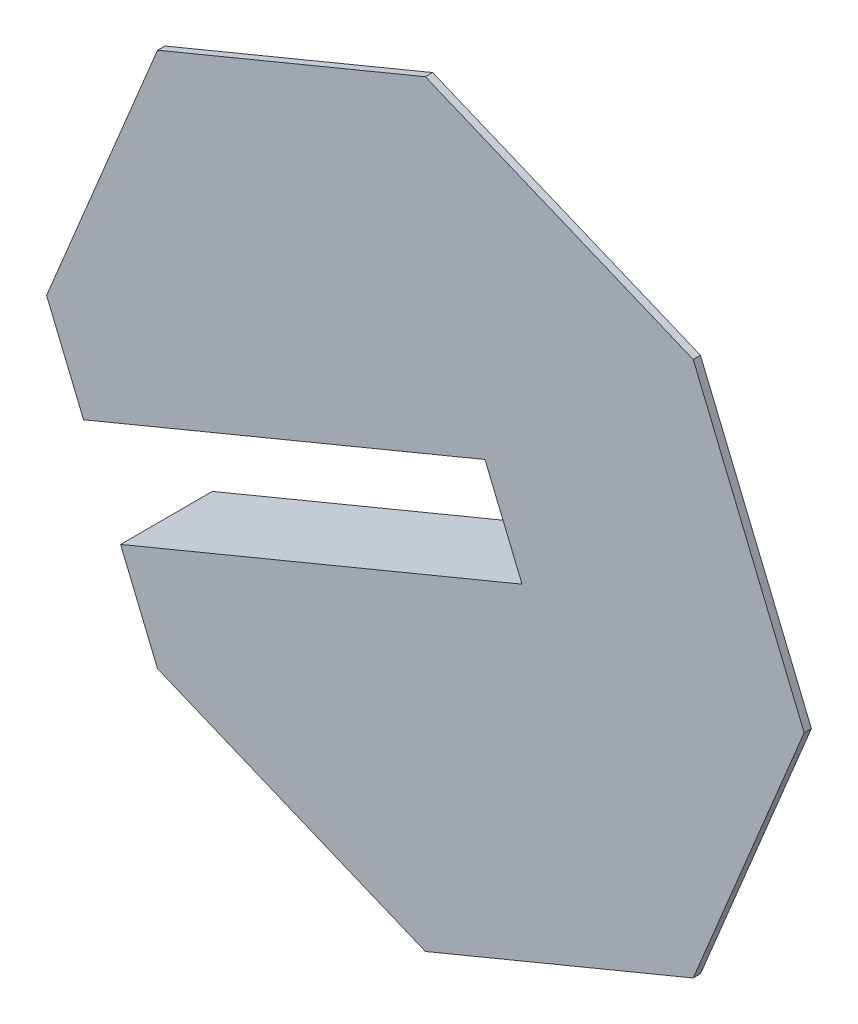
ISO-10303-21;
HEADER;
FILE_DESCRIPTION(('STEP AP214'),'2;1');
FILE_NAME('part.step','',(''),(''),'','','');
FILE_SCHEMA(('AUTOMOTIVE_DESIGN { 1 0 10303 214 1 1 1 1 }'));
ENDSEC;
DATA;
#1=APPLICATION_CONTEXT('core data for automotive mechanical design processes');
#2=APPLICATION_PROTOCOL_DEFINITION('international standard','automotive_design',2000,#1);
#3=PRODUCT_CONTEXT('',#1,'mechanical');
#4=PRODUCT('Part','Part','',(#3));
#5=PRODUCT_RELATED_PRODUCT_CATEGORY('part','',(#4));
#6=PRODUCT_DEFINITION_FORMATION('','',#4);
#7=PRODUCT_DEFINITION_CONTEXT('part definition',#1,'design');
#8=PRODUCT_DEFINITION('design','',#6,#7);
#9=PRODUCT_DEFINITION_SHAPE('','',#8);
#10=(LENGTH_UNIT() NAMED_UNIT(*) SI_UNIT(.MILLI.,.METRE.));
#11=(NAMED_UNIT(*) PLANE_ANGLE_UNIT() SI_UNIT($,.RADIAN.));
#12=(NAMED_UNIT(*) SI_UNIT($,.STERADIAN.) SOLID_ANGLE_UNIT());
#13=UNCERTAINTY_MEASURE_WITH_UNIT(LENGTH_MEASURE(1.E-05),#10,'distance_accuracy_value','');
#14=(GEOMETRIC_REPRESENTATION_CONTEXT(3) GLOBAL_UNCERTAINTY_ASSIGNED_CONTEXT((#13)) GLOBAL_UNIT_ASSIGNED_CONTEXT((#10,
#11,#12)) REPRESENTATION_CONTEXT('',''));
#15=CARTESIAN_POINT('',(0.,0.,0.));
#16=DIRECTION('',(0.,0.,1.));
#17=DIRECTION('',(1.,0.,0.));
#18=AXIS2_PLACEMENT_3D('',#15,#16,#17);
#19=CARTESIAN_POINT('',(0.,0.,0.));
#20=DIRECTION('',(0.,0.,1.));
#21=DIRECTION('',(1.,0.,0.));
#22=AXIS2_PLACEMENT_3D('',#19,#20,#21);
#23=PLANE('',#22);
#24=DIRECTION('',(0.382683432365089,-0.923879532511287,0.));
#25=VECTOR('',#24,1.);
#26=CARTESIAN_POINT('',(40.0028462053296,-5.11600630108544,0.));
#27=LINE('',#26,#25);
#28=CARTESIAN_POINT('',(40.0028462053296,-5.11600630108549,0.));
#29=VERTEX_POINT('',#28);
#30=CARTESIAN_POINT('',(41.1508965024248,-7.88764489861931,0.));
#31=VERTEX_POINT('',#30);
#32=EDGE_CURVE('E274',#29,#31,#27,.T.);
#33=ORIENTED_EDGE('',*,*,#32,.F.);
#34=DIRECTION('',(-0.382683432365089,0.923879532511287,0.));
#35=VECTOR('',#34,1.);
#36=CARTESIAN_POINT('',(40.0028462053296,-5.11600630108549,0.));
#37=LINE('',#36,#35);
#38=CARTESIAN_POINT('',(24.6687210704604,31.9038465666418,0.));
#39=VERTEX_POINT('',#38);
#40=EDGE_CURVE('E180',#29,#39,#37,.T.);
#41=ORIENTED_EDGE('',*,*,#40,.T.);
#42=DIRECTION('',(-0.923879532511287,-0.38268343236509,0.));
#43=VECTOR('',#42,1.);
#44=CARTESIAN_POINT('',(24.6687210704604,31.9038465666418,0.));
#45=LINE('',#44,#43);
#46=CARTESIAN_POINT('',(-141.493612410695,-36.9228455168135,0.));
#47=VERTEX_POINT('',#46);
#48=EDGE_CURVE('E177',#39,#47,#45,.T.);
#49=ORIENTED_EDGE('',*,*,#48,.T.);
#50=DIRECTION('',(0.382683432365089,-0.923879532511287,0.));
#51=VECTOR('',#50,1.);
#52=CARTESIAN_POINT('',(-156.787555785165,0.,0.));
#53=LINE('',#52,#51);
#54=CARTESIAN_POINT('',(-156.787555785165,0.,0.));
#55=VERTEX_POINT('',#54);
#56=EDGE_CURVE('E174',#55,#47,#53,.T.);
#57=ORIENTED_EDGE('',*,*,#56,.F.);
#58=DIRECTION('',(-0.38268343236509,-0.923879532511287,0.));
#59=VECTOR('',#58,1.);
#60=CARTESIAN_POINT('',(-110.865543901354,110.865543901355,0.));
#61=LINE('',#60,#59);
#62=CARTESIAN_POINT('',(-110.865543901354,110.865543901355,0.));
#63=VERTEX_POINT('',#62);
#64=EDGE_CURVE('E172',#63,#55,#61,.T.);
#65=ORIENTED_EDGE('',*,*,#64,.F.);
#66=DIRECTION('',(-0.923879532511287,-0.382683432365089,0.));
#67=VECTOR('',#66,1.);
#68=CARTESIAN_POINT('',(0.,156.787555785165,0.));
#69=LINE('',#68,#67);
#70=CARTESIAN_POINT('',(0.,156.787555785165,0.));
#71=VERTEX_POINT('',#70);
#72=EDGE_CURVE('E169',#71,#63,#69,.T.);
#73=ORIENTED_EDGE('',*,*,#72,.F.);
#74=DIRECTION('',(-0.923879532511287,0.38268343236509,0.));
#75=VECTOR('',#74,1.);
#76=CARTESIAN_POINT('',(110.865543901355,110.865543901355,0.));
#77=LINE('',#76,#75);
#78=CARTESIAN_POINT('',(110.865543901355,110.865543901355,0.));
#79=VERTEX_POINT('',#78);
#80=EDGE_CURVE('E166',#79,#71,#77,.T.);
#81=ORIENTED_EDGE('',*,*,#80,.F.);
#82=DIRECTION('',(-0.382683432365089,0.923879532511287,0.));
#83=VECTOR('',#82,1.);
#84=CARTESIAN_POINT('',(156.787555785165,0.,0.));
#85=LINE('',#84,#83);
#86=CARTESIAN_POINT('',(156.787555785165,0.,0.));
#87=VERTEX_POINT('',#86);
#88=EDGE_CURVE('E103',#87,#79,#85,.T.);
#89=ORIENTED_EDGE('',*,*,#88,.F.);
#90=DIRECTION('',(0.38268343236509,0.923879532511287,0.));
#91=VECTOR('',#90,1.);
#92=CARTESIAN_POINT('',(110.865543901355,-110.865543901354,0.));
#93=LINE('',#92,#91);
#94=CARTESIAN_POINT('',(110.865543901355,-110.865543901354,0.));
#95=VERTEX_POINT('',#94);
#96=EDGE_CURVE('E188',#95,#87,#93,.T.);
#97=ORIENTED_EDGE('',*,*,#96,.F.);
#98=DIRECTION('',(0.923879532511287,0.382683432365089,0.));
#99=VECTOR('',#98,1.);
#100=CARTESIAN_POINT('',(0.,-156.787555785165,0.));
#101=LINE('',#100,#99);
#102=CARTESIAN_POINT('',(0.,-156.787555785165,0.));
#103=VERTEX_POINT('',#102);
#104=EDGE_CURVE('E154',#103,#95,#101,.T.);
#105=ORIENTED_EDGE('',*,*,#104,.F.);
#106=DIRECTION('',(0.923879532511287,-0.38268343236509,0.));
#107=VECTOR('',#106,1.);
#108=CARTESIAN_POINT('',(-110.865543901355,-110.865543901354,0.));
#109=LINE('',#108,#107);
#110=CARTESIAN_POINT('',(-110.865543901355,-110.865543901354,0.));
#111=VERTEX_POINT('',#110);
#112=EDGE_CURVE('E185',#111,#103,#109,.T.);
#113=ORIENTED_EDGE('',*,*,#112,.F.);
#114=DIRECTION('',(0.38268343236509,-0.923879532511287,0.));
#115=VECTOR('',#114,1.);
#116=CARTESIAN_POINT('',(-126.159487275825,-73.9426983845408,0.));
#117=LINE('',#116,#115);
#118=CARTESIAN_POINT('',(-125.01143697873,-76.7143369820747,0.));
#119=VERTEX_POINT('',#118);
#120=EDGE_CURVE('E183',#119,#111,#117,.T.);
#121=ORIENTED_EDGE('',*,*,#120,.F.);
#122=DIRECTION('',(-0.923879532511287,-0.38268343236509,0.));
#123=VECTOR('',#122,1.);
#124=CARTESIAN_POINT('',(73.6052472738098,5.55538734890204,0.));
#125=LINE('',#124,#123);
#126=EDGE_CURVE('E53',#31,#119,#125,.T.);
#127=ORIENTED_EDGE('',*,*,#126,.F.);
#128=EDGE_LOOP('',(#33,#41,#49,#57,#65,#73,#81,#89,#97,#105,#113,#121,#127));
#129=FACE_BOUND('',#128,.T.);
#130=ADVANCED_FACE('F38',(#129),#23,.F.);
#131=CARTESIAN_POINT('',(110.865543901355,110.865543901355,3.));
#132=DIRECTION('',(-0.38268343236509,-0.923879532511287,0.));
#133=DIRECTION('',(0.923879532511287,-0.38268343236509,0.));
#134=AXIS2_PLACEMENT_3D('',#131,#132,#133);
#135=PLANE('',#134);
#136=ORIENTED_EDGE('',*,*,#80,.T.);
#137=DIRECTION('',(0.,0.,-1.));
#138=VECTOR('',#137,1.);
#139=CARTESIAN_POINT('',(0.,156.787555785165,3.));
#140=LINE('',#139,#138);
#141=CARTESIAN_POINT('',(0.,156.787555785165,3.));
#142=VERTEX_POINT('',#141);
#143=EDGE_CURVE('E11',#142,#71,#140,.T.);
#144=ORIENTED_EDGE('',*,*,#143,.F.);
#145=DIRECTION('',(-0.923879532511287,0.38268343236509,0.));
#146=VECTOR('',#145,1.);
#147=CARTESIAN_POINT('',(110.865543901355,110.865543901355,3.));
#148=LINE('',#147,#146);
#149=CARTESIAN_POINT('',(110.865543901355,110.865543901355,3.));
#150=VERTEX_POINT('',#149);
#151=EDGE_CURVE('E191',#150,#142,#148,.T.);
#152=ORIENTED_EDGE('',*,*,#151,.F.);
#153=DIRECTION('',(0.,0.,-1.));
#154=VECTOR('',#153,1.);
#155=CARTESIAN_POINT('',(110.865543901355,110.865543901355,3.));
#156=LINE('',#155,#154);
#157=EDGE_CURVE('E162',#150,#79,#156,.T.);
#158=ORIENTED_EDGE('',*,*,#157,.T.);
#159=EDGE_LOOP('',(#136,#144,#152,#158));
#160=FACE_BOUND('',#159,.T.);
#161=ADVANCED_FACE('F40',(#160),#135,.F.);
#162=CARTESIAN_POINT('',(0.,156.787555785165,3.));
#163=DIRECTION('',(0.382683432365089,-0.923879532511287,0.));
#164=DIRECTION('',(0.923879532511287,0.38268343236509,0.));
#165=AXIS2_PLACEMENT_3D('',#162,#163,#164);
#166=PLANE('',#165);
#167=ORIENTED_EDGE('',*,*,#72,.T.);
#168=DIRECTION('',(0.,0.,-1.));
#169=VECTOR('',#168,1.);
#170=CARTESIAN_POINT('',(-110.865543901354,110.865543901355,3.));
#171=LINE('',#170,#169);
#172=CARTESIAN_POINT('',(-110.865543901354,110.865543901355,3.));
#173=VERTEX_POINT('',#172);
#174=EDGE_CURVE('E46',#173,#63,#171,.T.);
#175=ORIENTED_EDGE('',*,*,#174,.F.);
#176=DIRECTION('',(-0.923879532511287,-0.382683432365089,0.));
#177=VECTOR('',#176,1.);
#178=CARTESIAN_POINT('',(0.,156.787555785165,3.));
#179=LINE('',#178,#177);
#180=EDGE_CURVE('E111',#142,#173,#179,.T.);
#181=ORIENTED_EDGE('',*,*,#180,.F.);
#182=ORIENTED_EDGE('',*,*,#143,.T.);
#183=EDGE_LOOP('',(#167,#175,#181,#182));
#184=FACE_BOUND('',#183,.T.);
#185=ADVANCED_FACE('F319',(#184),#166,.F.);
#186=CARTESIAN_POINT('',(-110.865543901354,110.865543901355,3.));
#187=DIRECTION('',(0.923879532511287,-0.38268343236509,0.));
#188=DIRECTION('',(0.38268343236509,0.923879532511287,0.));
#189=AXIS2_PLACEMENT_3D('',#186,#187,#188);
#190=PLANE('',#189);
#191=ORIENTED_EDGE('',*,*,#64,.T.);
#192=DIRECTION('',(0.,0.,-1.));
#193=VECTOR('',#192,1.);
#194=CARTESIAN_POINT('',(-156.787555785165,0.,3.));
#195=LINE('',#194,#193);
#196=CARTESIAN_POINT('',(-156.787555785165,0.,3.));
#197=VERTEX_POINT('',#196);
#198=EDGE_CURVE('E208',#197,#55,#195,.T.);
#199=ORIENTED_EDGE('',*,*,#198,.F.);
#200=DIRECTION('',(-0.38268343236509,-0.923879532511287,0.));
#201=VECTOR('',#200,1.);
#202=CARTESIAN_POINT('',(-110.865543901354,110.865543901355,3.));
#203=LINE('',#202,#201);
#204=EDGE_CURVE('E216',#173,#197,#203,.T.);
#205=ORIENTED_EDGE('',*,*,#204,.F.);
#206=ORIENTED_EDGE('',*,*,#174,.T.);
#207=EDGE_LOOP('',(#191,#199,#205,#206));
#208=FACE_BOUND('',#207,.T.);
#209=ADVANCED_FACE('F214',(#208),#190,.F.);
#210=CARTESIAN_POINT('',(-156.787555785165,0.,3.));
#211=DIRECTION('',(0.923879532511287,0.382683432365089,0.));
#212=DIRECTION('',(-0.382683432365089,0.923879532511287,0.));
#213=AXIS2_PLACEMENT_3D('',#210,#211,#212);
#214=PLANE('',#213);
#215=ORIENTED_EDGE('',*,*,#56,.T.);
#216=DIRECTION('',(0.,0.,-1.));
#217=VECTOR('',#216,1.);
#218=CARTESIAN_POINT('',(-141.493612410695,-36.9228455168135,3.));
#219=LINE('',#218,#217);
#220=CARTESIAN_POINT('',(-141.493612410695,-36.9228455168135,3.));
#221=VERTEX_POINT('',#220);
#222=EDGE_CURVE('E206',#221,#47,#219,.T.);
#223=ORIENTED_EDGE('',*,*,#222,.F.);
#224=DIRECTION('',(0.382683432365089,-0.923879532511287,0.));
#225=VECTOR('',#224,1.);
#226=CARTESIAN_POINT('',(-156.787555785165,0.,3.));
#227=LINE('',#226,#225);
#228=EDGE_CURVE('E225',#197,#221,#227,.T.);
#229=ORIENTED_EDGE('',*,*,#228,.F.);
#230=ORIENTED_EDGE('',*,*,#198,.T.);
#231=EDGE_LOOP('',(#215,#223,#229,#230));
#232=FACE_BOUND('',#231,.T.);
#233=ADVANCED_FACE('F222',(#232),#214,.F.);
#234=CARTESIAN_POINT('',(24.6687210704604,31.9038465666418,3.));
#235=DIRECTION('',(0.38268343236509,-0.923879532511287,0.));
#236=DIRECTION('',(0.923879532511287,0.38268343236509,0.));
#237=AXIS2_PLACEMENT_3D('',#234,#235,#236);
#238=PLANE('',#237);
#239=ORIENTED_EDGE('',*,*,#48,.F.);
#240=DIRECTION('',(0.,0.,-1.));
#241=VECTOR('',#240,1.);
#242=CARTESIAN_POINT('',(24.6687210704604,31.9038465666418,3.));
#243=LINE('',#242,#241);
#244=CARTESIAN_POINT('',(24.6687210704604,31.9038465666418,3.));
#245=VERTEX_POINT('',#244);
#246=EDGE_CURVE('E204',#245,#39,#243,.T.);
#247=ORIENTED_EDGE('',*,*,#246,.F.);
#248=DIRECTION('',(-0.923879532511287,-0.38268343236509,0.));
#249=VECTOR('',#248,1.);
#250=CARTESIAN_POINT('',(24.6687210704604,31.9038465666418,3.));
#251=LINE('',#250,#249);
#252=EDGE_CURVE('E227',#245,#221,#251,.T.);
#253=ORIENTED_EDGE('',*,*,#252,.T.);
#254=ORIENTED_EDGE('',*,*,#222,.T.);
#255=EDGE_LOOP('',(#239,#247,#253,#254));
#256=FACE_BOUND('',#255,.T.);
#257=ADVANCED_FACE('F303',(#256),#238,.T.);
#258=CARTESIAN_POINT('',(40.0028462053296,-5.11600630108549,3.));
#259=DIRECTION('',(-0.923879532511287,-0.382683432365089,0.));
#260=DIRECTION('',(0.382683432365089,-0.923879532511287,0.));
#261=AXIS2_PLACEMENT_3D('',#258,#259,#260);
#262=PLANE('',#261);
#263=ORIENTED_EDGE('',*,*,#40,.F.);
#264=DIRECTION('',(0.,0.,-1.));
#265=VECTOR('',#264,1.);
#266=CARTESIAN_POINT('',(40.0028462053296,-5.11600630108549,3.));
#267=LINE('',#266,#265);
#268=CARTESIAN_POINT('',(40.0028462053296,-5.11600630108549,3.));
#269=VERTEX_POINT('',#268);
#270=EDGE_CURVE('E201',#269,#29,#267,.T.);
#271=ORIENTED_EDGE('',*,*,#270,.F.);
#272=DIRECTION('',(-0.382683432365089,0.923879532511287,0.));
#273=VECTOR('',#272,1.);
#274=CARTESIAN_POINT('',(40.0028462053296,-5.11600630108549,3.));
#275=LINE('',#274,#273);
#276=EDGE_CURVE('E229',#269,#245,#275,.T.);
#277=ORIENTED_EDGE('',*,*,#276,.T.);
#278=ORIENTED_EDGE('',*,*,#246,.T.);
#279=EDGE_LOOP('',(#263,#271,#277,#278));
#280=FACE_BOUND('',#279,.T.);
#281=ADVANCED_FACE('F301',(#280),#262,.T.);
#282=CARTESIAN_POINT('',(-126.159487275825,-73.9426983845408,3.));
#283=DIRECTION('',(-0.382683432365089,0.923879532511287,0.));
#284=DIRECTION('',(-0.923879532511287,-0.382683432365089,0.));
#285=AXIS2_PLACEMENT_3D('',#282,#283,#284);
#286=PLANE('',#285);
#287=ORIENTED_EDGE('',*,*,#270,.T.);
#288=DIRECTION('',(0.,0.,1.));
#289=VECTOR('',#288,1.);
#290=CARTESIAN_POINT('',(40.0028462053296,-5.11600630108545,0.));
#291=LINE('',#290,#289);
#292=CARTESIAN_POINT('',(40.0028462053296,-5.11600630108545,-35.));
#293=VERTEX_POINT('',#292);
#294=EDGE_CURVE('E258',#293,#29,#291,.T.);
#295=ORIENTED_EDGE('',*,*,#294,.F.);
#296=DIRECTION('',(-0.923879532511287,-0.38268343236509,0.));
#297=VECTOR('',#296,1.);
#298=CARTESIAN_POINT('',(72.4571969767145,8.3270259464359,-35.));
#299=LINE('',#298,#297);
#300=CARTESIAN_POINT('',(-126.159487275825,-73.9426983845408,-35.));
#301=VERTEX_POINT('',#300);
#302=EDGE_CURVE('E259',#293,#301,#299,.T.);
#303=ORIENTED_EDGE('',*,*,#302,.T.);
#304=DIRECTION('',(0.,0.,-1.));
#305=VECTOR('',#304,1.);
#306=CARTESIAN_POINT('',(-126.159487275825,-73.9426983845408,3.));
#307=LINE('',#306,#305);
#308=CARTESIAN_POINT('',(-126.159487275825,-73.9426983845408,3.));
#309=VERTEX_POINT('',#308);
#310=EDGE_CURVE('E198',#309,#301,#307,.T.);
#311=ORIENTED_EDGE('',*,*,#310,.F.);
#312=DIRECTION('',(0.923879532511287,0.382683432365089,0.));
#313=VECTOR('',#312,1.);
#314=CARTESIAN_POINT('',(-126.159487275825,-73.9426983845408,3.));
#315=LINE('',#314,#313);
#316=EDGE_CURVE('E236',#309,#269,#315,.T.);
#317=ORIENTED_EDGE('',*,*,#316,.T.);
#318=EDGE_LOOP('',(#287,#295,#303,#311,#317));
#319=FACE_BOUND('',#318,.T.);
#320=ADVANCED_FACE('F295',(#319),#286,.T.);
#321=CARTESIAN_POINT('',(-126.159487275825,-73.9426983845408,3.));
#322=DIRECTION('',(0.923879532511287,0.382683432365089,0.));
#323=DIRECTION('',(-0.38268343236509,0.923879532511287,0.));
#324=AXIS2_PLACEMENT_3D('',#321,#322,#323);
#325=PLANE('',#324);
#326=ORIENTED_EDGE('',*,*,#310,.T.);
#327=DIRECTION('',(0.382683432365092,-0.923879532511286,0.));
#328=VECTOR('',#327,1.);
#329=CARTESIAN_POINT('',(-126.159487275825,-73.9426983845408,-35.));
#330=LINE('',#329,#328);
#331=CARTESIAN_POINT('',(-125.01143697873,-76.7143369820747,-35.));
#332=VERTEX_POINT('',#331);
#333=EDGE_CURVE('E269',#301,#332,#330,.T.);
#334=ORIENTED_EDGE('',*,*,#333,.T.);
#335=DIRECTION('',(0.,0.,1.));
#336=VECTOR('',#335,1.);
#337=CARTESIAN_POINT('',(-125.01143697873,-76.7143369820747,0.));
#338=LINE('',#337,#336);
#339=EDGE_CURVE('E263',#332,#119,#338,.T.);
#340=ORIENTED_EDGE('',*,*,#339,.T.);
#341=ORIENTED_EDGE('',*,*,#120,.T.);
#342=DIRECTION('',(0.,0.,-1.));
#343=VECTOR('',#342,1.);
#344=CARTESIAN_POINT('',(-110.865543901355,-110.865543901354,3.));
#345=LINE('',#344,#343);
#346=CARTESIAN_POINT('',(-110.865543901355,-110.865543901354,3.));
#347=VERTEX_POINT('',#346);
#348=EDGE_CURVE('E195',#347,#111,#345,.T.);
#349=ORIENTED_EDGE('',*,*,#348,.F.);
#350=DIRECTION('',(0.38268343236509,-0.923879532511287,0.));
#351=VECTOR('',#350,1.);
#352=CARTESIAN_POINT('',(-126.159487275825,-73.9426983845408,3.));
#353=LINE('',#352,#351);
#354=EDGE_CURVE('E239',#309,#347,#353,.T.);
#355=ORIENTED_EDGE('',*,*,#354,.F.);
#356=EDGE_LOOP('',(#326,#334,#340,#341,#349,#355));
#357=FACE_BOUND('',#356,.T.);
#358=ADVANCED_FACE('F245',(#357),#325,.F.);
#359=CARTESIAN_POINT('',(-110.865543901355,-110.865543901354,3.));
#360=DIRECTION('',(0.38268343236509,0.923879532511287,0.));
#361=DIRECTION('',(-0.923879532511287,0.38268343236509,0.));
#362=AXIS2_PLACEMENT_3D('',#359,#360,#361);
#363=PLANE('',#362);
#364=ORIENTED_EDGE('',*,*,#112,.T.);
#365=DIRECTION('',(0.,0.,-1.));
#366=VECTOR('',#365,1.);
#367=CARTESIAN_POINT('',(0.,-156.787555785165,3.));
#368=LINE('',#367,#366);
#369=CARTESIAN_POINT('',(0.,-156.787555785165,3.));
#370=VERTEX_POINT('',#369);
#371=EDGE_CURVE('E157',#370,#103,#368,.T.);
#372=ORIENTED_EDGE('',*,*,#371,.F.);
#373=DIRECTION('',(0.923879532511287,-0.38268343236509,0.));
#374=VECTOR('',#373,1.);
#375=CARTESIAN_POINT('',(-110.865543901355,-110.865543901354,3.));
#376=LINE('',#375,#374);
#377=EDGE_CURVE('E145',#347,#370,#376,.T.);
#378=ORIENTED_EDGE('',*,*,#377,.F.);
#379=ORIENTED_EDGE('',*,*,#348,.T.);
#380=EDGE_LOOP('',(#364,#372,#378,#379));
#381=FACE_BOUND('',#380,.T.);
#382=ADVANCED_FACE('F249',(#381),#363,.F.);
#383=CARTESIAN_POINT('',(0.,-156.787555785165,3.));
#384=DIRECTION('',(-0.382683432365089,0.923879532511287,0.));
#385=DIRECTION('',(-0.923879532511287,-0.38268343236509,0.));
#386=AXIS2_PLACEMENT_3D('',#383,#384,#385);
#387=PLANE('',#386);
#388=ORIENTED_EDGE('',*,*,#104,.T.);
#389=DIRECTION('',(0.,0.,-1.));
#390=VECTOR('',#389,1.);
#391=CARTESIAN_POINT('',(110.865543901355,-110.865543901354,3.));
#392=LINE('',#391,#390);
#393=CARTESIAN_POINT('',(110.865543901355,-110.865543901354,3.));
#394=VERTEX_POINT('',#393);
#395=EDGE_CURVE('E151',#394,#95,#392,.T.);
#396=ORIENTED_EDGE('',*,*,#395,.F.);
#397=DIRECTION('',(0.923879532511287,0.382683432365089,0.));
#398=VECTOR('',#397,1.);
#399=CARTESIAN_POINT('',(0.,-156.787555785165,3.));
#400=LINE('',#399,#398);
#401=EDGE_CURVE('E138',#370,#394,#400,.T.);
#402=ORIENTED_EDGE('',*,*,#401,.F.);
#403=ORIENTED_EDGE('',*,*,#371,.T.);
#404=EDGE_LOOP('',(#388,#396,#402,#403));
#405=FACE_BOUND('',#404,.T.);
#406=ADVANCED_FACE('F152',(#405),#387,.F.);
#407=CARTESIAN_POINT('',(110.865543901355,-110.865543901354,3.));
#408=DIRECTION('',(-0.923879532511287,0.38268343236509,0.));
#409=DIRECTION('',(-0.38268343236509,-0.923879532511287,0.));
#410=AXIS2_PLACEMENT_3D('',#407,#408,#409);
#411=PLANE('',#410);
#412=ORIENTED_EDGE('',*,*,#96,.T.);
#413=DIRECTION('',(0.,0.,-1.));
#414=VECTOR('',#413,1.);
#415=CARTESIAN_POINT('',(156.787555785165,0.,3.));
#416=LINE('',#415,#414);
#417=CARTESIAN_POINT('',(156.787555785165,0.,3.));
#418=VERTEX_POINT('',#417);
#419=EDGE_CURVE('E158',#418,#87,#416,.T.);
#420=ORIENTED_EDGE('',*,*,#419,.F.);
#421=DIRECTION('',(0.38268343236509,0.923879532511287,0.));
#422=VECTOR('',#421,1.);
#423=CARTESIAN_POINT('',(110.865543901355,-110.865543901354,3.));
#424=LINE('',#423,#422);
#425=EDGE_CURVE('E142',#394,#418,#424,.T.);
#426=ORIENTED_EDGE('',*,*,#425,.F.);
#427=ORIENTED_EDGE('',*,*,#395,.T.);
#428=EDGE_LOOP('',(#412,#420,#426,#427));
#429=FACE_BOUND('',#428,.T.);
#430=ADVANCED_FACE('F160',(#429),#411,.F.);
#431=CARTESIAN_POINT('',(156.787555785165,0.,3.));
#432=DIRECTION('',(-0.923879532511287,-0.382683432365089,0.));
#433=DIRECTION('',(0.382683432365089,-0.923879532511287,0.));
#434=AXIS2_PLACEMENT_3D('',#431,#432,#433);
#435=PLANE('',#434);
#436=ORIENTED_EDGE('',*,*,#88,.T.);
#437=ORIENTED_EDGE('',*,*,#157,.F.);
#438=DIRECTION('',(-0.382683432365089,0.923879532511287,0.));
#439=VECTOR('',#438,1.);
#440=CARTESIAN_POINT('',(156.787555785165,0.,3.));
#441=LINE('',#440,#439);
#442=EDGE_CURVE('E62',#418,#150,#441,.T.);
#443=ORIENTED_EDGE('',*,*,#442,.F.);
#444=ORIENTED_EDGE('',*,*,#419,.T.);
#445=EDGE_LOOP('',(#436,#437,#443,#444));
#446=FACE_BOUND('',#445,.T.);
#447=ADVANCED_FACE('F250',(#446),#435,.F.);
#448=CARTESIAN_POINT('',(0.,0.,3.));
#449=DIRECTION('',(0.,0.,1.));
#450=DIRECTION('',(1.,0.,0.));
#451=AXIS2_PLACEMENT_3D('',#448,#449,#450);
#452=PLANE('',#451);
#453=ORIENTED_EDGE('',*,*,#151,.T.);
#454=ORIENTED_EDGE('',*,*,#180,.T.);
#455=ORIENTED_EDGE('',*,*,#204,.T.);
#456=ORIENTED_EDGE('',*,*,#228,.T.);
#457=ORIENTED_EDGE('',*,*,#252,.F.);
#458=ORIENTED_EDGE('',*,*,#276,.F.);
#459=ORIENTED_EDGE('',*,*,#316,.F.);
#460=ORIENTED_EDGE('',*,*,#354,.T.);
#461=ORIENTED_EDGE('',*,*,#377,.T.);
#462=ORIENTED_EDGE('',*,*,#401,.T.);
#463=ORIENTED_EDGE('',*,*,#425,.T.);
#464=ORIENTED_EDGE('',*,*,#442,.T.);
#465=EDGE_LOOP('',(#453,#454,#455,#456,#457,#458,#459,#460,#461,#462,#463,#464));
#466=FACE_BOUND('',#465,.T.);
#467=ADVANCED_FACE('F140',(#466),#452,.T.);
#468=CARTESIAN_POINT('',(73.6052472738098,5.55538734890204,0.));
#469=DIRECTION('',(0.38268343236509,-0.923879532511287,0.));
#470=DIRECTION('',(0.923879532511287,0.38268343236509,0.));
#471=AXIS2_PLACEMENT_3D('',#468,#469,#470);
#472=PLANE('',#471);
#473=DIRECTION('',(0.,0.,-1.));
#474=VECTOR('',#473,1.);
#475=CARTESIAN_POINT('',(41.1508965024248,-7.88764489861931,0.));
#476=LINE('',#475,#474);
#477=CARTESIAN_POINT('',(41.1508965024248,-7.88764489861931,-35.));
#478=VERTEX_POINT('',#477);
#479=EDGE_CURVE('E267',#31,#478,#476,.T.);
#480=ORIENTED_EDGE('',*,*,#479,.F.);
#481=ORIENTED_EDGE('',*,*,#126,.T.);
#482=ORIENTED_EDGE('',*,*,#339,.F.);
#483=DIRECTION('',(-0.923879532511287,-0.38268343236509,0.));
#484=VECTOR('',#483,1.);
#485=CARTESIAN_POINT('',(73.6052472738098,5.55538734890204,-35.));
#486=LINE('',#485,#484);
#487=EDGE_CURVE('E262',#478,#332,#486,.T.);
#488=ORIENTED_EDGE('',*,*,#487,.F.);
#489=EDGE_LOOP('',(#480,#481,#482,#488));
#490=FACE_BOUND('',#489,.T.);
#491=ADVANCED_FACE('F287',(#490),#472,.T.);
#492=CARTESIAN_POINT('',(72.4571969767145,8.3270259464359,-35.));
#493=DIRECTION('',(0.,0.,-1.));
#494=DIRECTION('',(-1.,0.,0.));
#495=AXIS2_PLACEMENT_3D('',#492,#493,#494);
#496=PLANE('',#495);
#497=DIRECTION('',(-0.382683432365089,0.923879532511287,0.));
#498=VECTOR('',#497,1.);
#499=CARTESIAN_POINT('',(40.0028462053296,-5.11600630108544,-35.));
#500=LINE('',#499,#498);
#501=EDGE_CURVE('E170',#478,#293,#500,.T.);
#502=ORIENTED_EDGE('',*,*,#501,.F.);
#503=ORIENTED_EDGE('',*,*,#487,.T.);
#504=ORIENTED_EDGE('',*,*,#333,.F.);
#505=ORIENTED_EDGE('',*,*,#302,.F.);
#506=EDGE_LOOP('',(#502,#503,#504,#505));
#507=FACE_BOUND('',#506,.T.);
#508=ADVANCED_FACE('F292',(#507),#496,.T.);
#509=CARTESIAN_POINT('',(40.0028462053296,-5.11600630108549,3.));
#510=DIRECTION('',(-0.923879532511287,-0.382683432365089,0.));
#511=DIRECTION('',(0.382683432365089,-0.923879532511287,0.));
#512=AXIS2_PLACEMENT_3D('',#509,#510,#511);
#513=PLANE('',#512);
#514=ORIENTED_EDGE('',*,*,#294,.T.);
#515=ORIENTED_EDGE('',*,*,#32,.T.);
#516=ORIENTED_EDGE('',*,*,#479,.T.);
#517=ORIENTED_EDGE('',*,*,#501,.T.);
#518=EDGE_LOOP('',(#514,#515,#516,#517));
#519=FACE_BOUND('',#518,.T.);
#520=ADVANCED_FACE('F281',(#519),#513,.F.);
#521=CLOSED_SHELL('',(#130,#161,#185,#209,#233,#257,#281,#320,#358,#382,#406,#430,#447,#467,
#491,#508,#520));
#522=MANIFOLD_SOLID_BREP('B2',#521);
#523=ADVANCED_BREP_SHAPE_REPRESENTATION('',(#18,#522),#14);
#524=SHAPE_DEFINITION_REPRESENTATION(#9,#523);
ENDSEC;
END-ISO-10303-21;
